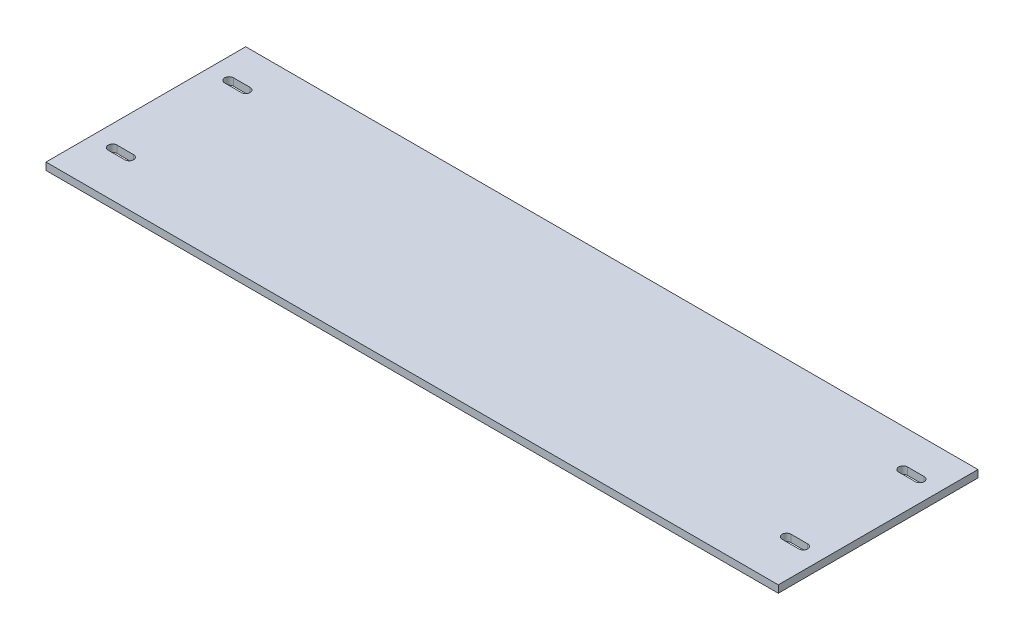
ISO-10303-21;
HEADER;
FILE_DESCRIPTION(('STEP AP214'),'2;1');
FILE_NAME('part.step','',(''),(''),'','','');
FILE_SCHEMA(('AUTOMOTIVE_DESIGN { 1 0 10303 214 1 1 1 1 }'));
ENDSEC;
DATA;
#1=APPLICATION_CONTEXT('core data for automotive mechanical design processes');
#2=APPLICATION_PROTOCOL_DEFINITION('international standard','automotive_design',2000,#1);
#3=PRODUCT_CONTEXT('',#1,'mechanical');
#4=PRODUCT('Part','Part','',(#3));
#5=PRODUCT_RELATED_PRODUCT_CATEGORY('part','',(#4));
#6=PRODUCT_DEFINITION_FORMATION('','',#4);
#7=PRODUCT_DEFINITION_CONTEXT('part definition',#1,'design');
#8=PRODUCT_DEFINITION('design','',#6,#7);
#9=PRODUCT_DEFINITION_SHAPE('','',#8);
#10=(LENGTH_UNIT() NAMED_UNIT(*) SI_UNIT(.MILLI.,.METRE.));
#11=(NAMED_UNIT(*) PLANE_ANGLE_UNIT() SI_UNIT($,.RADIAN.));
#12=(NAMED_UNIT(*) SI_UNIT($,.STERADIAN.) SOLID_ANGLE_UNIT());
#13=UNCERTAINTY_MEASURE_WITH_UNIT(LENGTH_MEASURE(1.E-05),#10,'distance_accuracy_value','');
#14=(GEOMETRIC_REPRESENTATION_CONTEXT(3) GLOBAL_UNCERTAINTY_ASSIGNED_CONTEXT((#13)) GLOBAL_UNIT_ASSIGNED_CONTEXT((#10,
#11,#12)) REPRESENTATION_CONTEXT('',''));
#15=CARTESIAN_POINT('',(0.,0.,0.));
#16=DIRECTION('',(0.,0.,1.));
#17=DIRECTION('',(1.,0.,0.));
#18=AXIS2_PLACEMENT_3D('',#15,#16,#17);
#19=CARTESIAN_POINT('',(0.,5.588,0.));
#20=DIRECTION('',(0.,-1.,0.));
#21=DIRECTION('',(0.,0.,-1.));
#22=AXIS2_PLACEMENT_3D('',#19,#20,#21);
#23=PLANE('',#22);
#24=CARTESIAN_POINT('',(542.925,5.588,-123.825));
#25=DIRECTION('',(0.,1.,0.));
#26=DIRECTION('',(0.,0.,1.));
#27=AXIS2_PLACEMENT_3D('',#24,#25,#26);
#28=CIRCLE('',#27,3.37819999999999);
#29=CARTESIAN_POINT('',(542.925,5.588,-120.4468));
#30=VERTEX_POINT('',#29);
#31=CARTESIAN_POINT('',(542.925,5.588,-127.2032));
#32=VERTEX_POINT('',#31);
#33=EDGE_CURVE('E206',#30,#32,#28,.T.);
#34=ORIENTED_EDGE('',*,*,#33,.F.);
#35=DIRECTION('',(1.,0.,0.));
#36=VECTOR('',#35,1.);
#37=CARTESIAN_POINT('',(542.925,5.588,-120.4468));
#38=LINE('',#37,#36);
#39=CARTESIAN_POINT('',(530.225,5.588,-120.4468));
#40=VERTEX_POINT('',#39);
#41=EDGE_CURVE('E214',#40,#30,#38,.T.);
#42=ORIENTED_EDGE('',*,*,#41,.F.);
#43=CARTESIAN_POINT('',(530.225,5.588,-123.825));
#44=DIRECTION('',(0.,1.,0.));
#45=DIRECTION('',(0.,0.,1.));
#46=AXIS2_PLACEMENT_3D('',#43,#44,#45);
#47=CIRCLE('',#46,3.37819999999999);
#48=CARTESIAN_POINT('',(530.225,5.588,-127.2032));
#49=VERTEX_POINT('',#48);
#50=EDGE_CURVE('E211',#49,#40,#47,.T.);
#51=ORIENTED_EDGE('',*,*,#50,.F.);
#52=DIRECTION('',(-1.,0.,0.));
#53=VECTOR('',#52,1.);
#54=CARTESIAN_POINT('',(542.925,5.588,-127.2032));
#55=LINE('',#54,#53);
#56=EDGE_CURVE('E208',#32,#49,#55,.T.);
#57=ORIENTED_EDGE('',*,*,#56,.F.);
#58=EDGE_LOOP('',(#34,#42,#51,#57));
#59=FACE_BOUND('',#58,.T.);
#60=CARTESIAN_POINT('',(15.875,5.588,-34.925));
#61=DIRECTION('',(0.,1.,0.));
#62=DIRECTION('',(0.,0.,1.));
#63=AXIS2_PLACEMENT_3D('',#60,#61,#62);
#64=CIRCLE('',#63,3.3782);
#65=CARTESIAN_POINT('',(15.875,5.588,-38.3032));
#66=VERTEX_POINT('',#65);
#67=CARTESIAN_POINT('',(15.875,5.588,-31.5468));
#68=VERTEX_POINT('',#67);
#69=EDGE_CURVE('E268',#66,#68,#64,.T.);
#70=ORIENTED_EDGE('',*,*,#69,.F.);
#71=DIRECTION('',(-1.,0.,0.));
#72=VECTOR('',#71,1.);
#73=CARTESIAN_POINT('',(15.875,5.588,-38.3032));
#74=LINE('',#73,#72);
#75=CARTESIAN_POINT('',(28.575,5.588,-38.3032));
#76=VERTEX_POINT('',#75);
#77=EDGE_CURVE('E276',#76,#66,#74,.T.);
#78=ORIENTED_EDGE('',*,*,#77,.F.);
#79=CARTESIAN_POINT('',(28.575,5.588,-34.925));
#80=DIRECTION('',(0.,1.,0.));
#81=DIRECTION('',(0.,0.,1.));
#82=AXIS2_PLACEMENT_3D('',#79,#80,#81);
#83=CIRCLE('',#82,3.3782);
#84=CARTESIAN_POINT('',(28.575,5.588,-31.5468));
#85=VERTEX_POINT('',#84);
#86=EDGE_CURVE('E273',#85,#76,#83,.T.);
#87=ORIENTED_EDGE('',*,*,#86,.F.);
#88=DIRECTION('',(1.,0.,0.));
#89=VECTOR('',#88,1.);
#90=CARTESIAN_POINT('',(15.875,5.588,-31.5468));
#91=LINE('',#90,#89);
#92=EDGE_CURVE('E270',#68,#85,#91,.T.);
#93=ORIENTED_EDGE('',*,*,#92,.F.);
#94=EDGE_LOOP('',(#70,#78,#87,#93));
#95=FACE_BOUND('',#94,.T.);
#96=DIRECTION('',(0.,0.,1.));
#97=VECTOR('',#96,1.);
#98=CARTESIAN_POINT('',(0.,5.588,0.));
#99=LINE('',#98,#97);
#100=CARTESIAN_POINT('',(0.,5.588,-152.4));
#101=VERTEX_POINT('',#100);
#102=CARTESIAN_POINT('',(0.,5.588,0.));
#103=VERTEX_POINT('',#102);
#104=EDGE_CURVE('E299',#101,#103,#99,.T.);
#105=ORIENTED_EDGE('',*,*,#104,.T.);
#106=DIRECTION('',(1.,0.,0.));
#107=VECTOR('',#106,1.);
#108=CARTESIAN_POINT('',(0.,5.588,0.));
#109=LINE('',#108,#107);
#110=CARTESIAN_POINT('',(558.8,5.588,0.));
#111=VERTEX_POINT('',#110);
#112=EDGE_CURVE('E302',#103,#111,#109,.T.);
#113=ORIENTED_EDGE('',*,*,#112,.T.);
#114=DIRECTION('',(0.,0.,-1.));
#115=VECTOR('',#114,1.);
#116=CARTESIAN_POINT('',(558.8,5.588,0.));
#117=LINE('',#116,#115);
#118=CARTESIAN_POINT('',(558.8,5.588,-152.4));
#119=VERTEX_POINT('',#118);
#120=EDGE_CURVE('E305',#111,#119,#117,.T.);
#121=ORIENTED_EDGE('',*,*,#120,.T.);
#122=DIRECTION('',(-1.,0.,0.));
#123=VECTOR('',#122,1.);
#124=CARTESIAN_POINT('',(0.,5.588,-152.4));
#125=LINE('',#124,#123);
#126=EDGE_CURVE('E307',#119,#101,#125,.T.);
#127=ORIENTED_EDGE('',*,*,#126,.T.);
#128=EDGE_LOOP('',(#105,#113,#121,#127));
#129=FACE_BOUND('',#128,.T.);
#130=CARTESIAN_POINT('',(15.875,5.588,-123.825));
#131=DIRECTION('',(0.,1.,0.));
#132=DIRECTION('',(0.,0.,1.));
#133=AXIS2_PLACEMENT_3D('',#130,#131,#132);
#134=CIRCLE('',#133,3.37819999999998);
#135=CARTESIAN_POINT('',(15.875,5.588,-127.2032));
#136=VERTEX_POINT('',#135);
#137=CARTESIAN_POINT('',(15.875,5.588,-120.4468));
#138=VERTEX_POINT('',#137);
#139=EDGE_CURVE('E237',#136,#138,#134,.T.);
#140=ORIENTED_EDGE('',*,*,#139,.F.);
#141=DIRECTION('',(-1.,0.,0.));
#142=VECTOR('',#141,1.);
#143=CARTESIAN_POINT('',(15.875,5.588,-127.2032));
#144=LINE('',#143,#142);
#145=CARTESIAN_POINT('',(28.575,5.588,-127.2032));
#146=VERTEX_POINT('',#145);
#147=EDGE_CURVE('E245',#146,#136,#144,.T.);
#148=ORIENTED_EDGE('',*,*,#147,.F.);
#149=CARTESIAN_POINT('',(28.575,5.588,-123.825));
#150=DIRECTION('',(0.,1.,0.));
#151=DIRECTION('',(0.,0.,1.));
#152=AXIS2_PLACEMENT_3D('',#149,#150,#151);
#153=CIRCLE('',#152,3.37819999999998);
#154=CARTESIAN_POINT('',(28.575,5.588,-120.4468));
#155=VERTEX_POINT('',#154);
#156=EDGE_CURVE('E242',#155,#146,#153,.T.);
#157=ORIENTED_EDGE('',*,*,#156,.F.);
#158=DIRECTION('',(1.,0.,0.));
#159=VECTOR('',#158,1.);
#160=CARTESIAN_POINT('',(15.875,5.588,-120.4468));
#161=LINE('',#160,#159);
#162=EDGE_CURVE('E239',#138,#155,#161,.T.);
#163=ORIENTED_EDGE('',*,*,#162,.F.);
#164=EDGE_LOOP('',(#140,#148,#157,#163));
#165=FACE_BOUND('',#164,.T.);
#166=CARTESIAN_POINT('',(542.925,5.588,-34.925));
#167=DIRECTION('',(0.,1.,0.));
#168=DIRECTION('',(0.,0.,1.));
#169=AXIS2_PLACEMENT_3D('',#166,#167,#168);
#170=CIRCLE('',#169,3.37819999999999);
#171=CARTESIAN_POINT('',(542.925,5.588,-31.5468));
#172=VERTEX_POINT('',#171);
#173=CARTESIAN_POINT('',(542.925,5.588,-38.3032));
#174=VERTEX_POINT('',#173);
#175=EDGE_CURVE('E170',#172,#174,#170,.T.);
#176=ORIENTED_EDGE('',*,*,#175,.F.);
#177=DIRECTION('',(1.,0.,0.));
#178=VECTOR('',#177,1.);
#179=CARTESIAN_POINT('',(542.925,5.588,-31.5468));
#180=LINE('',#179,#178);
#181=CARTESIAN_POINT('',(530.225,5.588,-31.5468));
#182=VERTEX_POINT('',#181);
#183=EDGE_CURVE('E192',#182,#172,#180,.T.);
#184=ORIENTED_EDGE('',*,*,#183,.F.);
#185=CARTESIAN_POINT('',(530.225,5.588,-34.925));
#186=DIRECTION('',(0.,1.,0.));
#187=DIRECTION('',(0.,0.,1.));
#188=AXIS2_PLACEMENT_3D('',#185,#186,#187);
#189=CIRCLE('',#188,3.37819999999999);
#190=CARTESIAN_POINT('',(530.225,5.588,-38.3032));
#191=VERTEX_POINT('',#190);
#192=EDGE_CURVE('E190',#191,#182,#189,.T.);
#193=ORIENTED_EDGE('',*,*,#192,.F.);
#194=DIRECTION('',(-1.,0.,0.));
#195=VECTOR('',#194,1.);
#196=CARTESIAN_POINT('',(542.925,5.588,-38.3032));
#197=LINE('',#196,#195);
#198=EDGE_CURVE('E178',#174,#191,#197,.T.);
#199=ORIENTED_EDGE('',*,*,#198,.F.);
#200=EDGE_LOOP('',(#176,#184,#193,#199));
#201=FACE_BOUND('',#200,.T.);
#202=ADVANCED_FACE('F33',(#59,#95,#129,#165,#201),#23,.F.);
#203=CARTESIAN_POINT('',(0.,0.,0.));
#204=DIRECTION('',(0.,-1.,0.));
#205=DIRECTION('',(0.,0.,-1.));
#206=AXIS2_PLACEMENT_3D('',#203,#204,#205);
#207=PLANE('',#206);
#208=DIRECTION('',(0.,0.,1.));
#209=VECTOR('',#208,1.);
#210=CARTESIAN_POINT('',(0.,0.,0.));
#211=LINE('',#210,#209);
#212=CARTESIAN_POINT('',(0.,0.,-152.4));
#213=VERTEX_POINT('',#212);
#214=CARTESIAN_POINT('',(0.,0.,0.));
#215=VERTEX_POINT('',#214);
#216=EDGE_CURVE('E298',#213,#215,#211,.T.);
#217=ORIENTED_EDGE('',*,*,#216,.F.);
#218=DIRECTION('',(-1.,0.,0.));
#219=VECTOR('',#218,1.);
#220=CARTESIAN_POINT('',(0.,0.,-152.4));
#221=LINE('',#220,#219);
#222=CARTESIAN_POINT('',(558.8,0.,-152.4));
#223=VERTEX_POINT('',#222);
#224=EDGE_CURVE('E303',#223,#213,#221,.T.);
#225=ORIENTED_EDGE('',*,*,#224,.F.);
#226=DIRECTION('',(0.,0.,-1.));
#227=VECTOR('',#226,1.);
#228=CARTESIAN_POINT('',(558.8,0.,0.));
#229=LINE('',#228,#227);
#230=CARTESIAN_POINT('',(558.8,0.,0.));
#231=VERTEX_POINT('',#230);
#232=EDGE_CURVE('E314',#231,#223,#229,.T.);
#233=ORIENTED_EDGE('',*,*,#232,.F.);
#234=DIRECTION('',(1.,0.,0.));
#235=VECTOR('',#234,1.);
#236=CARTESIAN_POINT('',(0.,0.,0.));
#237=LINE('',#236,#235);
#238=EDGE_CURVE('E312',#215,#231,#237,.T.);
#239=ORIENTED_EDGE('',*,*,#238,.F.);
#240=EDGE_LOOP('',(#217,#225,#233,#239));
#241=FACE_BOUND('',#240,.T.);
#242=DIRECTION('',(-1.,0.,0.));
#243=VECTOR('',#242,1.);
#244=CARTESIAN_POINT('',(15.875,0.,-38.3032));
#245=LINE('',#244,#243);
#246=CARTESIAN_POINT('',(28.575,0.,-38.3032));
#247=VERTEX_POINT('',#246);
#248=CARTESIAN_POINT('',(15.875,0.,-38.3032));
#249=VERTEX_POINT('',#248);
#250=EDGE_CURVE('E271',#247,#249,#245,.T.);
#251=ORIENTED_EDGE('',*,*,#250,.T.);
#252=CARTESIAN_POINT('',(15.875,0.,-34.925));
#253=DIRECTION('',(0.,1.,0.));
#254=DIRECTION('',(0.,0.,1.));
#255=AXIS2_PLACEMENT_3D('',#252,#253,#254);
#256=CIRCLE('',#255,3.3782);
#257=CARTESIAN_POINT('',(15.875,0.,-31.5468));
#258=VERTEX_POINT('',#257);
#259=EDGE_CURVE('E267',#249,#258,#256,.T.);
#260=ORIENTED_EDGE('',*,*,#259,.T.);
#261=DIRECTION('',(1.,0.,0.));
#262=VECTOR('',#261,1.);
#263=CARTESIAN_POINT('',(15.875,0.,-31.5468));
#264=LINE('',#263,#262);
#265=CARTESIAN_POINT('',(28.575,0.,-31.5468));
#266=VERTEX_POINT('',#265);
#267=EDGE_CURVE('E281',#258,#266,#264,.T.);
#268=ORIENTED_EDGE('',*,*,#267,.T.);
#269=CARTESIAN_POINT('',(28.575,0.,-34.925));
#270=DIRECTION('',(0.,1.,0.));
#271=DIRECTION('',(0.,0.,1.));
#272=AXIS2_PLACEMENT_3D('',#269,#270,#271);
#273=CIRCLE('',#272,3.3782);
#274=EDGE_CURVE('E284',#266,#247,#273,.T.);
#275=ORIENTED_EDGE('',*,*,#274,.T.);
#276=EDGE_LOOP('',(#251,#260,#268,#275));
#277=FACE_BOUND('',#276,.T.);
#278=DIRECTION('',(-1.,0.,0.));
#279=VECTOR('',#278,1.);
#280=CARTESIAN_POINT('',(15.875,0.,-127.2032));
#281=LINE('',#280,#279);
#282=CARTESIAN_POINT('',(28.575,0.,-127.2032));
#283=VERTEX_POINT('',#282);
#284=CARTESIAN_POINT('',(15.875,0.,-127.2032));
#285=VERTEX_POINT('',#284);
#286=EDGE_CURVE('E240',#283,#285,#281,.T.);
#287=ORIENTED_EDGE('',*,*,#286,.T.);
#288=CARTESIAN_POINT('',(15.875,0.,-123.825));
#289=DIRECTION('',(0.,1.,0.));
#290=DIRECTION('',(0.,0.,1.));
#291=AXIS2_PLACEMENT_3D('',#288,#289,#290);
#292=CIRCLE('',#291,3.37819999999998);
#293=CARTESIAN_POINT('',(15.875,0.,-120.4468));
#294=VERTEX_POINT('',#293);
#295=EDGE_CURVE('E236',#285,#294,#292,.T.);
#296=ORIENTED_EDGE('',*,*,#295,.T.);
#297=DIRECTION('',(1.,0.,0.));
#298=VECTOR('',#297,1.);
#299=CARTESIAN_POINT('',(15.875,0.,-120.4468));
#300=LINE('',#299,#298);
#301=CARTESIAN_POINT('',(28.575,0.,-120.4468));
#302=VERTEX_POINT('',#301);
#303=EDGE_CURVE('E250',#294,#302,#300,.T.);
#304=ORIENTED_EDGE('',*,*,#303,.T.);
#305=CARTESIAN_POINT('',(28.575,0.,-123.825));
#306=DIRECTION('',(0.,1.,0.));
#307=DIRECTION('',(0.,0.,1.));
#308=AXIS2_PLACEMENT_3D('',#305,#306,#307);
#309=CIRCLE('',#308,3.37819999999998);
#310=EDGE_CURVE('E253',#302,#283,#309,.T.);
#311=ORIENTED_EDGE('',*,*,#310,.T.);
#312=EDGE_LOOP('',(#287,#296,#304,#311));
#313=FACE_BOUND('',#312,.T.);
#314=DIRECTION('',(1.,0.,0.));
#315=VECTOR('',#314,1.);
#316=CARTESIAN_POINT('',(542.925,0.,-120.4468));
#317=LINE('',#316,#315);
#318=CARTESIAN_POINT('',(530.225,0.,-120.4468));
#319=VERTEX_POINT('',#318);
#320=CARTESIAN_POINT('',(542.925,0.,-120.4468));
#321=VERTEX_POINT('',#320);
#322=EDGE_CURVE('E209',#319,#321,#317,.T.);
#323=ORIENTED_EDGE('',*,*,#322,.T.);
#324=CARTESIAN_POINT('',(542.925,0.,-123.825));
#325=DIRECTION('',(0.,1.,0.));
#326=DIRECTION('',(0.,0.,1.));
#327=AXIS2_PLACEMENT_3D('',#324,#325,#326);
#328=CIRCLE('',#327,3.37819999999999);
#329=CARTESIAN_POINT('',(542.925,0.,-127.2032));
#330=VERTEX_POINT('',#329);
#331=EDGE_CURVE('E186',#321,#330,#328,.T.);
#332=ORIENTED_EDGE('',*,*,#331,.T.);
#333=DIRECTION('',(-1.,0.,0.));
#334=VECTOR('',#333,1.);
#335=CARTESIAN_POINT('',(542.925,0.,-127.2032));
#336=LINE('',#335,#334);
#337=CARTESIAN_POINT('',(530.225,0.,-127.2032));
#338=VERTEX_POINT('',#337);
#339=EDGE_CURVE('E219',#330,#338,#336,.T.);
#340=ORIENTED_EDGE('',*,*,#339,.T.);
#341=CARTESIAN_POINT('',(530.225,0.,-123.825));
#342=DIRECTION('',(0.,1.,0.));
#343=DIRECTION('',(0.,0.,1.));
#344=AXIS2_PLACEMENT_3D('',#341,#342,#343);
#345=CIRCLE('',#344,3.37819999999999);
#346=EDGE_CURVE('E222',#338,#319,#345,.T.);
#347=ORIENTED_EDGE('',*,*,#346,.T.);
#348=EDGE_LOOP('',(#323,#332,#340,#347));
#349=FACE_BOUND('',#348,.T.);
#350=DIRECTION('',(1.,0.,0.));
#351=VECTOR('',#350,1.);
#352=CARTESIAN_POINT('',(542.925,0.,-31.5468));
#353=LINE('',#352,#351);
#354=CARTESIAN_POINT('',(530.225,0.,-31.5468));
#355=VERTEX_POINT('',#354);
#356=CARTESIAN_POINT('',(542.925,0.,-31.5468));
#357=VERTEX_POINT('',#356);
#358=EDGE_CURVE('E179',#355,#357,#353,.T.);
#359=ORIENTED_EDGE('',*,*,#358,.T.);
#360=CARTESIAN_POINT('',(542.925,0.,-34.925));
#361=DIRECTION('',(0.,1.,0.));
#362=DIRECTION('',(0.,0.,1.));
#363=AXIS2_PLACEMENT_3D('',#360,#361,#362);
#364=CIRCLE('',#363,3.37819999999999);
#365=CARTESIAN_POINT('',(542.925,0.,-38.3032));
#366=VERTEX_POINT('',#365);
#367=EDGE_CURVE('E56',#357,#366,#364,.T.);
#368=ORIENTED_EDGE('',*,*,#367,.T.);
#369=DIRECTION('',(-1.,0.,0.));
#370=VECTOR('',#369,1.);
#371=CARTESIAN_POINT('',(542.925,0.,-38.3032));
#372=LINE('',#371,#370);
#373=CARTESIAN_POINT('',(530.225,0.,-38.3032));
#374=VERTEX_POINT('',#373);
#375=EDGE_CURVE('E185',#366,#374,#372,.T.);
#376=ORIENTED_EDGE('',*,*,#375,.T.);
#377=CARTESIAN_POINT('',(530.225,0.,-34.925));
#378=DIRECTION('',(0.,1.,0.));
#379=DIRECTION('',(0.,0.,1.));
#380=AXIS2_PLACEMENT_3D('',#377,#378,#379);
#381=CIRCLE('',#380,3.37819999999999);
#382=EDGE_CURVE('E198',#374,#355,#381,.T.);
#383=ORIENTED_EDGE('',*,*,#382,.T.);
#384=EDGE_LOOP('',(#359,#368,#376,#383));
#385=FACE_BOUND('',#384,.T.);
#386=ADVANCED_FACE('F332',(#241,#277,#313,#349,#385),#207,.T.);
#387=CARTESIAN_POINT('',(0.,5.588,0.));
#388=DIRECTION('',(1.,0.,0.));
#389=DIRECTION('',(0.,0.,-1.));
#390=AXIS2_PLACEMENT_3D('',#387,#388,#389);
#391=PLANE('',#390);
#392=ORIENTED_EDGE('',*,*,#216,.T.);
#393=DIRECTION('',(0.,-1.,0.));
#394=VECTOR('',#393,1.);
#395=CARTESIAN_POINT('',(0.,5.588,0.));
#396=LINE('',#395,#394);
#397=EDGE_CURVE('E11',#103,#215,#396,.T.);
#398=ORIENTED_EDGE('',*,*,#397,.F.);
#399=ORIENTED_EDGE('',*,*,#104,.F.);
#400=DIRECTION('',(0.,-1.,0.));
#401=VECTOR('',#400,1.);
#402=CARTESIAN_POINT('',(0.,5.588,-152.4));
#403=LINE('',#402,#401);
#404=EDGE_CURVE('E309',#101,#213,#403,.T.);
#405=ORIENTED_EDGE('',*,*,#404,.T.);
#406=EDGE_LOOP('',(#392,#398,#399,#405));
#407=FACE_BOUND('',#406,.T.);
#408=ADVANCED_FACE('F35',(#407),#391,.F.);
#409=CARTESIAN_POINT('',(0.,5.588,0.));
#410=DIRECTION('',(0.,0.,-1.));
#411=DIRECTION('',(-1.,0.,0.));
#412=AXIS2_PLACEMENT_3D('',#409,#410,#411);
#413=PLANE('',#412);
#414=ORIENTED_EDGE('',*,*,#238,.T.);
#415=DIRECTION('',(0.,-1.,0.));
#416=VECTOR('',#415,1.);
#417=CARTESIAN_POINT('',(558.8,5.588,0.));
#418=LINE('',#417,#416);
#419=EDGE_CURVE('E41',#111,#231,#418,.T.);
#420=ORIENTED_EDGE('',*,*,#419,.F.);
#421=ORIENTED_EDGE('',*,*,#112,.F.);
#422=ORIENTED_EDGE('',*,*,#397,.T.);
#423=EDGE_LOOP('',(#414,#420,#421,#422));
#424=FACE_BOUND('',#423,.T.);
#425=ADVANCED_FACE('F343',(#424),#413,.F.);
#426=CARTESIAN_POINT('',(558.8,5.588,0.));
#427=DIRECTION('',(-1.,0.,0.));
#428=DIRECTION('',(0.,0.,1.));
#429=AXIS2_PLACEMENT_3D('',#426,#427,#428);
#430=PLANE('',#429);
#431=ORIENTED_EDGE('',*,*,#232,.T.);
#432=DIRECTION('',(0.,-1.,0.));
#433=VECTOR('',#432,1.);
#434=CARTESIAN_POINT('',(558.8,5.588,-152.4));
#435=LINE('',#434,#433);
#436=EDGE_CURVE('E319',#119,#223,#435,.T.);
#437=ORIENTED_EDGE('',*,*,#436,.F.);
#438=ORIENTED_EDGE('',*,*,#120,.F.);
#439=ORIENTED_EDGE('',*,*,#419,.T.);
#440=EDGE_LOOP('',(#431,#437,#438,#439));
#441=FACE_BOUND('',#440,.T.);
#442=ADVANCED_FACE('F326',(#441),#430,.F.);
#443=CARTESIAN_POINT('',(0.,5.588,-152.4));
#444=DIRECTION('',(0.,0.,1.));
#445=DIRECTION('',(1.,0.,0.));
#446=AXIS2_PLACEMENT_3D('',#443,#444,#445);
#447=PLANE('',#446);
#448=ORIENTED_EDGE('',*,*,#224,.T.);
#449=ORIENTED_EDGE('',*,*,#404,.F.);
#450=ORIENTED_EDGE('',*,*,#126,.F.);
#451=ORIENTED_EDGE('',*,*,#436,.T.);
#452=EDGE_LOOP('',(#448,#449,#450,#451));
#453=FACE_BOUND('',#452,.T.);
#454=ADVANCED_FACE('F336',(#453),#447,.F.);
#455=CARTESIAN_POINT('',(15.875,5.588,-34.925));
#456=DIRECTION('',(0.,-1.,0.));
#457=DIRECTION('',(0.,0.,-1.));
#458=AXIS2_PLACEMENT_3D('',#455,#456,#457);
#459=CYLINDRICAL_SURFACE('',#458,3.3782);
#460=ORIENTED_EDGE('',*,*,#259,.F.);
#461=DIRECTION('',(0.,-1.,0.));
#462=VECTOR('',#461,1.);
#463=CARTESIAN_POINT('',(15.875,5.588,-38.3032));
#464=LINE('',#463,#462);
#465=EDGE_CURVE('E278',#66,#249,#464,.T.);
#466=ORIENTED_EDGE('',*,*,#465,.F.);
#467=ORIENTED_EDGE('',*,*,#69,.T.);
#468=DIRECTION('',(0.,-1.,0.));
#469=VECTOR('',#468,1.);
#470=CARTESIAN_POINT('',(15.875,5.588,-31.5468));
#471=LINE('',#470,#469);
#472=EDGE_CURVE('E295',#68,#258,#471,.T.);
#473=ORIENTED_EDGE('',*,*,#472,.T.);
#474=EDGE_LOOP('',(#460,#466,#467,#473));
#475=FACE_BOUND('',#474,.T.);
#476=ADVANCED_FACE('F360',(#475),#459,.F.);
#477=CARTESIAN_POINT('',(15.875,5.588,-31.5468));
#478=DIRECTION('',(0.,0.,-1.));
#479=DIRECTION('',(-1.,0.,0.));
#480=AXIS2_PLACEMENT_3D('',#477,#478,#479);
#481=PLANE('',#480);
#482=ORIENTED_EDGE('',*,*,#267,.F.);
#483=ORIENTED_EDGE('',*,*,#472,.F.);
#484=ORIENTED_EDGE('',*,*,#92,.T.);
#485=DIRECTION('',(0.,-1.,0.));
#486=VECTOR('',#485,1.);
#487=CARTESIAN_POINT('',(28.575,5.588,-31.5468));
#488=LINE('',#487,#486);
#489=EDGE_CURVE('E293',#85,#266,#488,.T.);
#490=ORIENTED_EDGE('',*,*,#489,.T.);
#491=EDGE_LOOP('',(#482,#483,#484,#490));
#492=FACE_BOUND('',#491,.T.);
#493=ADVANCED_FACE('F367',(#492),#481,.T.);
#494=CARTESIAN_POINT('',(28.575,5.588,-34.925));
#495=DIRECTION('',(0.,-1.,0.));
#496=DIRECTION('',(0.,0.,-1.));
#497=AXIS2_PLACEMENT_3D('',#494,#495,#496);
#498=CYLINDRICAL_SURFACE('',#497,3.3782);
#499=ORIENTED_EDGE('',*,*,#274,.F.);
#500=ORIENTED_EDGE('',*,*,#489,.F.);
#501=ORIENTED_EDGE('',*,*,#86,.T.);
#502=DIRECTION('',(0.,-1.,0.));
#503=VECTOR('',#502,1.);
#504=CARTESIAN_POINT('',(28.575,5.588,-38.3032));
#505=LINE('',#504,#503);
#506=EDGE_CURVE('E291',#76,#247,#505,.T.);
#507=ORIENTED_EDGE('',*,*,#506,.T.);
#508=EDGE_LOOP('',(#499,#500,#501,#507));
#509=FACE_BOUND('',#508,.T.);
#510=ADVANCED_FACE('F372',(#509),#498,.F.);
#511=CARTESIAN_POINT('',(15.875,5.588,-38.3032));
#512=DIRECTION('',(0.,0.,1.));
#513=DIRECTION('',(1.,0.,0.));
#514=AXIS2_PLACEMENT_3D('',#511,#512,#513);
#515=PLANE('',#514);
#516=ORIENTED_EDGE('',*,*,#250,.F.);
#517=ORIENTED_EDGE('',*,*,#506,.F.);
#518=ORIENTED_EDGE('',*,*,#77,.T.);
#519=ORIENTED_EDGE('',*,*,#465,.T.);
#520=EDGE_LOOP('',(#516,#517,#518,#519));
#521=FACE_BOUND('',#520,.T.);
#522=ADVANCED_FACE('F379',(#521),#515,.T.);
#523=CARTESIAN_POINT('',(15.875,5.588,-123.825));
#524=DIRECTION('',(0.,-1.,0.));
#525=DIRECTION('',(0.,0.,-1.));
#526=AXIS2_PLACEMENT_3D('',#523,#524,#525);
#527=CYLINDRICAL_SURFACE('',#526,3.37819999999998);
#528=ORIENTED_EDGE('',*,*,#295,.F.);
#529=DIRECTION('',(0.,-1.,0.));
#530=VECTOR('',#529,1.);
#531=CARTESIAN_POINT('',(15.875,5.588,-127.2032));
#532=LINE('',#531,#530);
#533=EDGE_CURVE('E247',#136,#285,#532,.T.);
#534=ORIENTED_EDGE('',*,*,#533,.F.);
#535=ORIENTED_EDGE('',*,*,#139,.T.);
#536=DIRECTION('',(0.,-1.,0.));
#537=VECTOR('',#536,1.);
#538=CARTESIAN_POINT('',(15.875,5.588,-120.4468));
#539=LINE('',#538,#537);
#540=EDGE_CURVE('E264',#138,#294,#539,.T.);
#541=ORIENTED_EDGE('',*,*,#540,.T.);
#542=EDGE_LOOP('',(#528,#534,#535,#541));
#543=FACE_BOUND('',#542,.T.);
#544=ADVANCED_FACE('F392',(#543),#527,.F.);
#545=CARTESIAN_POINT('',(15.875,5.588,-120.4468));
#546=DIRECTION('',(0.,0.,-1.));
#547=DIRECTION('',(-1.,0.,0.));
#548=AXIS2_PLACEMENT_3D('',#545,#546,#547);
#549=PLANE('',#548);
#550=ORIENTED_EDGE('',*,*,#303,.F.);
#551=ORIENTED_EDGE('',*,*,#540,.F.);
#552=ORIENTED_EDGE('',*,*,#162,.T.);
#553=DIRECTION('',(0.,-1.,0.));
#554=VECTOR('',#553,1.);
#555=CARTESIAN_POINT('',(28.575,5.588,-120.4468));
#556=LINE('',#555,#554);
#557=EDGE_CURVE('E262',#155,#302,#556,.T.);
#558=ORIENTED_EDGE('',*,*,#557,.T.);
#559=EDGE_LOOP('',(#550,#551,#552,#558));
#560=FACE_BOUND('',#559,.T.);
#561=ADVANCED_FACE('F397',(#560),#549,.T.);
#562=CARTESIAN_POINT('',(28.575,5.588,-123.825));
#563=DIRECTION('',(0.,-1.,0.));
#564=DIRECTION('',(0.,0.,-1.));
#565=AXIS2_PLACEMENT_3D('',#562,#563,#564);
#566=CYLINDRICAL_SURFACE('',#565,3.37819999999998);
#567=ORIENTED_EDGE('',*,*,#310,.F.);
#568=ORIENTED_EDGE('',*,*,#557,.F.);
#569=ORIENTED_EDGE('',*,*,#156,.T.);
#570=DIRECTION('',(0.,-1.,0.));
#571=VECTOR('',#570,1.);
#572=CARTESIAN_POINT('',(28.575,5.588,-127.2032));
#573=LINE('',#572,#571);
#574=EDGE_CURVE('E260',#146,#283,#573,.T.);
#575=ORIENTED_EDGE('',*,*,#574,.T.);
#576=EDGE_LOOP('',(#567,#568,#569,#575));
#577=FACE_BOUND('',#576,.T.);
#578=ADVANCED_FACE('F401',(#577),#566,.F.);
#579=CARTESIAN_POINT('',(15.875,5.588,-127.2032));
#580=DIRECTION('',(0.,0.,1.));
#581=DIRECTION('',(1.,0.,0.));
#582=AXIS2_PLACEMENT_3D('',#579,#580,#581);
#583=PLANE('',#582);
#584=ORIENTED_EDGE('',*,*,#286,.F.);
#585=ORIENTED_EDGE('',*,*,#574,.F.);
#586=ORIENTED_EDGE('',*,*,#147,.T.);
#587=ORIENTED_EDGE('',*,*,#533,.T.);
#588=EDGE_LOOP('',(#584,#585,#586,#587));
#589=FACE_BOUND('',#588,.T.);
#590=ADVANCED_FACE('F405',(#589),#583,.T.);
#591=CARTESIAN_POINT('',(542.925,5.588,-123.825));
#592=DIRECTION('',(0.,-1.,0.));
#593=DIRECTION('',(0.,0.,-1.));
#594=AXIS2_PLACEMENT_3D('',#591,#592,#593);
#595=CYLINDRICAL_SURFACE('',#594,3.37819999999999);
#596=ORIENTED_EDGE('',*,*,#331,.F.);
#597=DIRECTION('',(0.,-1.,0.));
#598=VECTOR('',#597,1.);
#599=CARTESIAN_POINT('',(542.925,5.588,-120.4468));
#600=LINE('',#599,#598);
#601=EDGE_CURVE('E216',#30,#321,#600,.T.);
#602=ORIENTED_EDGE('',*,*,#601,.F.);
#603=ORIENTED_EDGE('',*,*,#33,.T.);
#604=DIRECTION('',(0.,-1.,0.));
#605=VECTOR('',#604,1.);
#606=CARTESIAN_POINT('',(542.925,5.588,-127.2032));
#607=LINE('',#606,#605);
#608=EDGE_CURVE('E233',#32,#330,#607,.T.);
#609=ORIENTED_EDGE('',*,*,#608,.T.);
#610=EDGE_LOOP('',(#596,#602,#603,#609));
#611=FACE_BOUND('',#610,.T.);
#612=ADVANCED_FACE('F409',(#611),#595,.F.);
#613=CARTESIAN_POINT('',(542.925,5.588,-127.2032));
#614=DIRECTION('',(0.,0.,1.));
#615=DIRECTION('',(1.,0.,0.));
#616=AXIS2_PLACEMENT_3D('',#613,#614,#615);
#617=PLANE('',#616);
#618=ORIENTED_EDGE('',*,*,#339,.F.);
#619=ORIENTED_EDGE('',*,*,#608,.F.);
#620=ORIENTED_EDGE('',*,*,#56,.T.);
#621=DIRECTION('',(0.,-1.,0.));
#622=VECTOR('',#621,1.);
#623=CARTESIAN_POINT('',(530.225,5.588,-127.2032));
#624=LINE('',#623,#622);
#625=EDGE_CURVE('E231',#49,#338,#624,.T.);
#626=ORIENTED_EDGE('',*,*,#625,.T.);
#627=EDGE_LOOP('',(#618,#619,#620,#626));
#628=FACE_BOUND('',#627,.T.);
#629=ADVANCED_FACE('F413',(#628),#617,.T.);
#630=CARTESIAN_POINT('',(530.225,5.588,-123.825));
#631=DIRECTION('',(0.,-1.,0.));
#632=DIRECTION('',(0.,0.,-1.));
#633=AXIS2_PLACEMENT_3D('',#630,#631,#632);
#634=CYLINDRICAL_SURFACE('',#633,3.37819999999999);
#635=ORIENTED_EDGE('',*,*,#346,.F.);
#636=ORIENTED_EDGE('',*,*,#625,.F.);
#637=ORIENTED_EDGE('',*,*,#50,.T.);
#638=DIRECTION('',(0.,-1.,0.));
#639=VECTOR('',#638,1.);
#640=CARTESIAN_POINT('',(530.225,5.588,-120.4468));
#641=LINE('',#640,#639);
#642=EDGE_CURVE('E229',#40,#319,#641,.T.);
#643=ORIENTED_EDGE('',*,*,#642,.T.);
#644=EDGE_LOOP('',(#635,#636,#637,#643));
#645=FACE_BOUND('',#644,.T.);
#646=ADVANCED_FACE('F417',(#645),#634,.F.);
#647=CARTESIAN_POINT('',(542.925,5.588,-120.4468));
#648=DIRECTION('',(0.,0.,-1.));
#649=DIRECTION('',(-1.,0.,0.));
#650=AXIS2_PLACEMENT_3D('',#647,#648,#649);
#651=PLANE('',#650);
#652=ORIENTED_EDGE('',*,*,#322,.F.);
#653=ORIENTED_EDGE('',*,*,#642,.F.);
#654=ORIENTED_EDGE('',*,*,#41,.T.);
#655=ORIENTED_EDGE('',*,*,#601,.T.);
#656=EDGE_LOOP('',(#652,#653,#654,#655));
#657=FACE_BOUND('',#656,.T.);
#658=ADVANCED_FACE('F421',(#657),#651,.T.);
#659=CARTESIAN_POINT('',(542.925,5.588,-34.925));
#660=DIRECTION('',(0.,-1.,0.));
#661=DIRECTION('',(0.,0.,-1.));
#662=AXIS2_PLACEMENT_3D('',#659,#660,#661);
#663=CYLINDRICAL_SURFACE('',#662,3.37819999999999);
#664=ORIENTED_EDGE('',*,*,#367,.F.);
#665=DIRECTION('',(0.,-1.,0.));
#666=VECTOR('',#665,1.);
#667=CARTESIAN_POINT('',(542.925,5.588,-31.5468));
#668=LINE('',#667,#666);
#669=EDGE_CURVE('E174',#172,#357,#668,.T.);
#670=ORIENTED_EDGE('',*,*,#669,.F.);
#671=ORIENTED_EDGE('',*,*,#175,.T.);
#672=DIRECTION('',(0.,-1.,0.));
#673=VECTOR('',#672,1.);
#674=CARTESIAN_POINT('',(542.925,5.588,-38.3032));
#675=LINE('',#674,#673);
#676=EDGE_CURVE('E173',#174,#366,#675,.T.);
#677=ORIENTED_EDGE('',*,*,#676,.T.);
#678=EDGE_LOOP('',(#664,#670,#671,#677));
#679=FACE_BOUND('',#678,.T.);
#680=ADVANCED_FACE('F172',(#679),#663,.F.);
#681=CARTESIAN_POINT('',(542.925,5.588,-38.3032));
#682=DIRECTION('',(0.,0.,1.));
#683=DIRECTION('',(1.,0.,0.));
#684=AXIS2_PLACEMENT_3D('',#681,#682,#683);
#685=PLANE('',#684);
#686=ORIENTED_EDGE('',*,*,#375,.F.);
#687=ORIENTED_EDGE('',*,*,#676,.F.);
#688=ORIENTED_EDGE('',*,*,#198,.T.);
#689=DIRECTION('',(0.,-1.,0.));
#690=VECTOR('',#689,1.);
#691=CARTESIAN_POINT('',(530.225,5.588,-38.3032));
#692=LINE('',#691,#690);
#693=EDGE_CURVE('E187',#191,#374,#692,.T.);
#694=ORIENTED_EDGE('',*,*,#693,.T.);
#695=EDGE_LOOP('',(#686,#687,#688,#694));
#696=FACE_BOUND('',#695,.T.);
#697=ADVANCED_FACE('F182',(#696),#685,.T.);
#698=CARTESIAN_POINT('',(530.225,5.588,-34.925));
#699=DIRECTION('',(0.,-1.,0.));
#700=DIRECTION('',(0.,0.,-1.));
#701=AXIS2_PLACEMENT_3D('',#698,#699,#700);
#702=CYLINDRICAL_SURFACE('',#701,3.37819999999999);
#703=ORIENTED_EDGE('',*,*,#382,.F.);
#704=ORIENTED_EDGE('',*,*,#693,.F.);
#705=ORIENTED_EDGE('',*,*,#192,.T.);
#706=DIRECTION('',(0.,-1.,0.));
#707=VECTOR('',#706,1.);
#708=CARTESIAN_POINT('',(530.225,5.588,-31.5468));
#709=LINE('',#708,#707);
#710=EDGE_CURVE('E48',#182,#355,#709,.T.);
#711=ORIENTED_EDGE('',*,*,#710,.T.);
#712=EDGE_LOOP('',(#703,#704,#705,#711));
#713=FACE_BOUND('',#712,.T.);
#714=ADVANCED_FACE('F430',(#713),#702,.F.);
#715=CARTESIAN_POINT('',(542.925,5.588,-31.5468));
#716=DIRECTION('',(0.,0.,-1.));
#717=DIRECTION('',(-1.,0.,0.));
#718=AXIS2_PLACEMENT_3D('',#715,#716,#717);
#719=PLANE('',#718);
#720=ORIENTED_EDGE('',*,*,#358,.F.);
#721=ORIENTED_EDGE('',*,*,#710,.F.);
#722=ORIENTED_EDGE('',*,*,#183,.T.);
#723=ORIENTED_EDGE('',*,*,#669,.T.);
#724=EDGE_LOOP('',(#720,#721,#722,#723));
#725=FACE_BOUND('',#724,.T.);
#726=ADVANCED_FACE('F433',(#725),#719,.T.);
#727=CLOSED_SHELL('',(#202,#386,#408,#425,#442,#454,#476,#493,#510,#522,#544,#561,#578,#590,
#612,#629,#646,#658,#680,#697,#714,#726));
#728=MANIFOLD_SOLID_BREP('B2',#727);
#729=ADVANCED_BREP_SHAPE_REPRESENTATION('',(#18,#728),#14);
#730=SHAPE_DEFINITION_REPRESENTATION(#9,#729);
ENDSEC;
END-ISO-10303-21;
